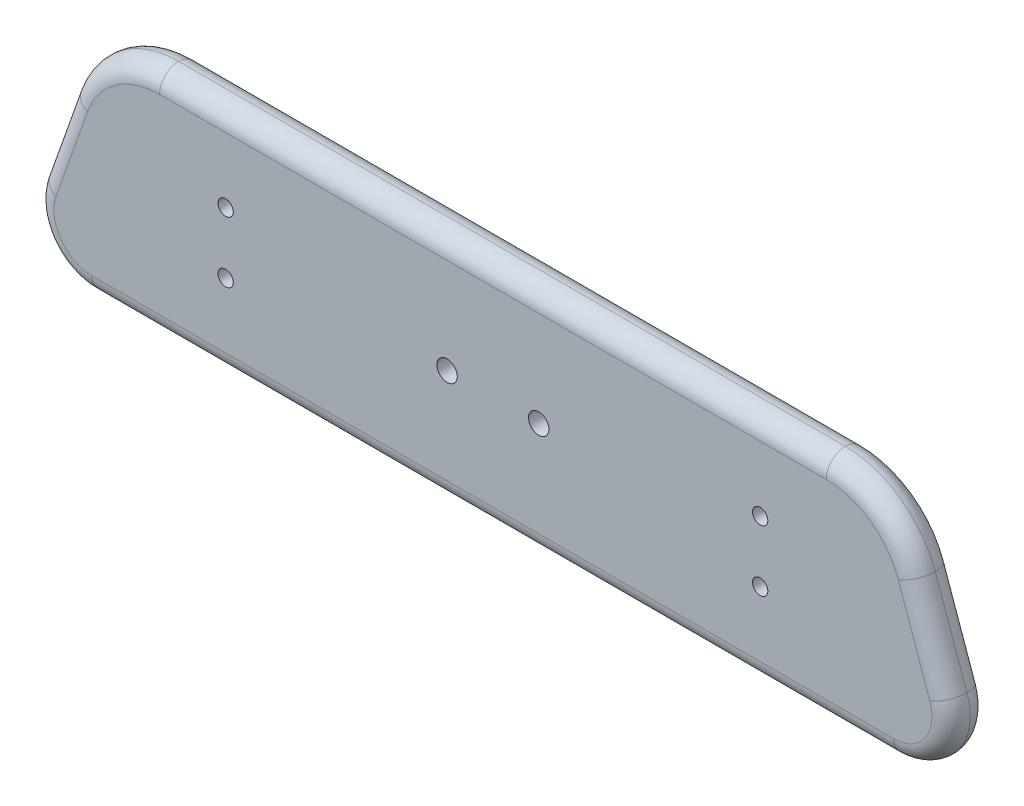
ISO-10303-21;
HEADER;
FILE_DESCRIPTION(('STEP AP214'),'2;1');
FILE_NAME('part.step','',(''),(''),'','','');
FILE_SCHEMA(('AUTOMOTIVE_DESIGN { 1 0 10303 214 1 1 1 1 }'));
ENDSEC;
DATA;
#1=APPLICATION_CONTEXT('core data for automotive mechanical design processes');
#2=APPLICATION_PROTOCOL_DEFINITION('international standard','automotive_design',2000,#1);
#3=PRODUCT_CONTEXT('',#1,'mechanical');
#4=PRODUCT('Part','Part','',(#3));
#5=PRODUCT_RELATED_PRODUCT_CATEGORY('part','',(#4));
#6=PRODUCT_DEFINITION_FORMATION('','',#4);
#7=PRODUCT_DEFINITION_CONTEXT('part definition',#1,'design');
#8=PRODUCT_DEFINITION('design','',#6,#7);
#9=PRODUCT_DEFINITION_SHAPE('','',#8);
#10=(LENGTH_UNIT() NAMED_UNIT(*) SI_UNIT(.MILLI.,.METRE.));
#11=(NAMED_UNIT(*) PLANE_ANGLE_UNIT() SI_UNIT($,.RADIAN.));
#12=(NAMED_UNIT(*) SI_UNIT($,.STERADIAN.) SOLID_ANGLE_UNIT());
#13=UNCERTAINTY_MEASURE_WITH_UNIT(LENGTH_MEASURE(1.E-05),#10,'distance_accuracy_value','');
#14=(GEOMETRIC_REPRESENTATION_CONTEXT(3) GLOBAL_UNCERTAINTY_ASSIGNED_CONTEXT((#13)) GLOBAL_UNIT_ASSIGNED_CONTEXT((#10,
#11,#12)) REPRESENTATION_CONTEXT('',''));
#15=CARTESIAN_POINT('',(0.,0.,0.));
#16=DIRECTION('',(0.,0.,1.));
#17=DIRECTION('',(1.,0.,0.));
#18=AXIS2_PLACEMENT_3D('',#15,#16,#17);
#19=CARTESIAN_POINT('',(-105.,15.,10.));
#20=DIRECTION('',(0.,0.,-1.));
#21=DIRECTION('',(-1.,0.,0.));
#22=AXIS2_PLACEMENT_3D('',#19,#20,#21);
#23=PLANE('',#22);
#24=CARTESIAN_POINT('',(12.,30.,10.));
#25=DIRECTION('',(0.,0.,-1.));
#26=DIRECTION('',(-1.,0.,0.));
#27=AXIS2_PLACEMENT_3D('',#24,#25,#26);
#28=CIRCLE('',#27,2.67221258206621);
#29=CARTESIAN_POINT('',(9.32778741793379,30.,10.));
#30=VERTEX_POINT('',#29);
#31=EDGE_CURVE('E706',#30,#30,#28,.T.);
#32=ORIENTED_EDGE('',*,*,#31,.T.);
#33=EDGE_LOOP('',(#32));
#34=FACE_BOUND('',#33,.T.);
#35=CARTESIAN_POINT('',(-12.,30.,10.));
#36=DIRECTION('',(0.,0.,-1.));
#37=DIRECTION('',(-1.,0.,0.));
#38=AXIS2_PLACEMENT_3D('',#35,#36,#37);
#39=CIRCLE('',#38,2.67221258206621);
#40=CARTESIAN_POINT('',(-14.6722125820662,30.,10.));
#41=VERTEX_POINT('',#40);
#42=EDGE_CURVE('E711',#41,#41,#39,.T.);
#43=ORIENTED_EDGE('',*,*,#42,.T.);
#44=EDGE_LOOP('',(#43));
#45=FACE_BOUND('',#44,.T.);
#46=DIRECTION('',(-0.333806859233774,-0.942641491092177,0.));
#47=VECTOR('',#46,1.);
#48=CARTESIAN_POINT('',(-114.426414910922,18.3380685923377,10.));
#49=LINE('',#48,#47);
#50=CARTESIAN_POINT('',(-106.161971375379,41.6761371846755,10.));
#51=VERTEX_POINT('',#50);
#52=CARTESIAN_POINT('',(-114.426414910922,18.3380685923377,10.));
#53=VERTEX_POINT('',#52);
#54=EDGE_CURVE('E51',#51,#53,#49,.T.);
#55=ORIENTED_EDGE('',*,*,#54,.T.);
#56=CARTESIAN_POINT('',(-105.,15.,10.));
#57=DIRECTION('',(0.,0.,-1.));
#58=DIRECTION('',(-1.,0.,0.));
#59=AXIS2_PLACEMENT_3D('',#56,#57,#58);
#60=CIRCLE('',#59,9.99999999999999);
#61=CARTESIAN_POINT('',(-105.,4.99999999999999,10.));
#62=VERTEX_POINT('',#61);
#63=EDGE_CURVE('E11',#53,#62,#60,.F.);
#64=ORIENTED_EDGE('',*,*,#63,.T.);
#65=DIRECTION('',(1.,0.,0.));
#66=VECTOR('',#65,1.);
#67=CARTESIAN_POINT('',(-105.,4.99999999999999,10.));
#68=LINE('',#67,#66);
#69=CARTESIAN_POINT('',(105.,5.00000000000001,10.));
#70=VERTEX_POINT('',#69);
#71=EDGE_CURVE('E323',#62,#70,#68,.T.);
#72=ORIENTED_EDGE('',*,*,#71,.T.);
#73=CARTESIAN_POINT('',(105.,15.,10.));
#74=DIRECTION('',(0.,0.,-1.));
#75=DIRECTION('',(-1.,0.,0.));
#76=AXIS2_PLACEMENT_3D('',#73,#74,#75);
#77=CIRCLE('',#76,10.);
#78=CARTESIAN_POINT('',(114.426414910922,18.3380685923378,10.));
#79=VERTEX_POINT('',#78);
#80=EDGE_CURVE('E326',#70,#79,#77,.F.);
#81=ORIENTED_EDGE('',*,*,#80,.T.);
#82=DIRECTION('',(-0.333806859233775,0.942641491092177,0.));
#83=VECTOR('',#82,1.);
#84=CARTESIAN_POINT('',(91.0267408639031,84.4167096525714,10.));
#85=LINE('',#84,#83);
#86=CARTESIAN_POINT('',(106.161971375379,41.6761371846755,10.));
#87=VERTEX_POINT('',#86);
#88=EDGE_CURVE('E329',#79,#87,#85,.T.);
#89=ORIENTED_EDGE('',*,*,#88,.T.);
#90=CARTESIAN_POINT('',(87.3091415535359,35.,10.));
#91=DIRECTION('',(0.,0.,-1.));
#92=DIRECTION('',(-1.,0.,0.));
#93=AXIS2_PLACEMENT_3D('',#90,#91,#92);
#94=CIRCLE('',#93,20.);
#95=CARTESIAN_POINT('',(87.309141553536,55.,10.));
#96=VERTEX_POINT('',#95);
#97=EDGE_CURVE('E153',#87,#96,#94,.F.);
#98=ORIENTED_EDGE('',*,*,#97,.T.);
#99=DIRECTION('',(-1.,0.,0.));
#100=VECTOR('',#99,1.);
#101=CARTESIAN_POINT('',(-105.,55.,10.));
#102=LINE('',#101,#100);
#103=CARTESIAN_POINT('',(-87.309141553536,55.,10.));
#104=VERTEX_POINT('',#103);
#105=EDGE_CURVE('E146',#96,#104,#102,.T.);
#106=ORIENTED_EDGE('',*,*,#105,.T.);
#107=CARTESIAN_POINT('',(-87.309141553536,35.,10.));
#108=DIRECTION('',(0.,0.,-1.));
#109=DIRECTION('',(-1.,0.,0.));
#110=AXIS2_PLACEMENT_3D('',#107,#108,#109);
#111=CIRCLE('',#110,20.);
#112=EDGE_CURVE('E150',#104,#51,#111,.F.);
#113=ORIENTED_EDGE('',*,*,#112,.T.);
#114=EDGE_LOOP('',(#55,#64,#72,#81,#89,#98,#106,#113));
#115=FACE_BOUND('',#114,.T.);
#116=CARTESIAN_POINT('',(-70.,38.,10.));
#117=DIRECTION('',(0.,0.,1.));
#118=DIRECTION('',(1.,0.,0.));
#119=AXIS2_PLACEMENT_3D('',#116,#117,#118);
#120=CIRCLE('',#119,2.);
#121=CARTESIAN_POINT('',(-68.,38.,10.));
#122=VERTEX_POINT('',#121);
#123=EDGE_CURVE('E281',#122,#122,#120,.T.);
#124=ORIENTED_EDGE('',*,*,#123,.F.);
#125=EDGE_LOOP('',(#124));
#126=FACE_BOUND('',#125,.T.);
#127=CARTESIAN_POINT('',(70.,22.,10.));
#128=DIRECTION('',(0.,0.,1.));
#129=DIRECTION('',(-1.,0.,0.));
#130=AXIS2_PLACEMENT_3D('',#127,#128,#129);
#131=CIRCLE('',#130,2.);
#132=CARTESIAN_POINT('',(68.,22.,10.));
#133=VERTEX_POINT('',#132);
#134=EDGE_CURVE('E272',#133,#133,#131,.T.);
#135=ORIENTED_EDGE('',*,*,#134,.F.);
#136=EDGE_LOOP('',(#135));
#137=FACE_BOUND('',#136,.T.);
#138=CARTESIAN_POINT('',(70.,38.,10.));
#139=DIRECTION('',(0.,0.,1.));
#140=DIRECTION('',(-1.,0.,0.));
#141=AXIS2_PLACEMENT_3D('',#138,#139,#140);
#142=CIRCLE('',#141,2.);
#143=CARTESIAN_POINT('',(68.,38.,10.));
#144=VERTEX_POINT('',#143);
#145=EDGE_CURVE('E261',#144,#144,#142,.T.);
#146=ORIENTED_EDGE('',*,*,#145,.F.);
#147=EDGE_LOOP('',(#146));
#148=FACE_BOUND('',#147,.T.);
#149=CARTESIAN_POINT('',(-70.,22.,10.));
#150=DIRECTION('',(0.,0.,1.));
#151=DIRECTION('',(1.,0.,0.));
#152=AXIS2_PLACEMENT_3D('',#149,#150,#151);
#153=CIRCLE('',#152,2.);
#154=CARTESIAN_POINT('',(-68.,22.,10.));
#155=VERTEX_POINT('',#154);
#156=EDGE_CURVE('E280',#155,#155,#153,.T.);
#157=ORIENTED_EDGE('',*,*,#156,.F.);
#158=EDGE_LOOP('',(#157));
#159=FACE_BOUND('',#158,.T.);
#160=ADVANCED_FACE('F41',(#34,#45,#115,#126,#137,#148,#159),#23,.F.);
#161=CARTESIAN_POINT('',(-105.,15.,0.));
#162=DIRECTION('',(0.,0.,-1.));
#163=DIRECTION('',(-1.,0.,0.));
#164=AXIS2_PLACEMENT_3D('',#161,#162,#163);
#165=PLANE('',#164);
#166=DIRECTION('',(0.,1.,0.));
#167=VECTOR('',#166,1.);
#168=CARTESIAN_POINT('',(-23.,50.,0.));
#169=LINE('',#168,#167);
#170=CARTESIAN_POINT('',(-23.,10.,0.));
#171=VERTEX_POINT('',#170);
#172=CARTESIAN_POINT('',(-23.,50.,0.));
#173=VERTEX_POINT('',#172);
#174=EDGE_CURVE('E59',#171,#173,#169,.T.);
#175=ORIENTED_EDGE('',*,*,#174,.F.);
#176=DIRECTION('',(-1.,0.,0.));
#177=VECTOR('',#176,1.);
#178=CARTESIAN_POINT('',(-23.,10.,0.));
#179=LINE('',#178,#177);
#180=CARTESIAN_POINT('',(23.,9.99999999999999,0.));
#181=VERTEX_POINT('',#180);
#182=EDGE_CURVE('E729',#181,#171,#179,.T.);
#183=ORIENTED_EDGE('',*,*,#182,.F.);
#184=DIRECTION('',(0.,-1.,0.));
#185=VECTOR('',#184,1.);
#186=CARTESIAN_POINT('',(23.,9.99999999999999,0.));
#187=LINE('',#186,#185);
#188=CARTESIAN_POINT('',(23.,50.,0.));
#189=VERTEX_POINT('',#188);
#190=EDGE_CURVE('E748',#189,#181,#187,.T.);
#191=ORIENTED_EDGE('',*,*,#190,.F.);
#192=DIRECTION('',(1.,0.,0.));
#193=VECTOR('',#192,1.);
#194=CARTESIAN_POINT('',(23.,50.,0.));
#195=LINE('',#194,#193);
#196=EDGE_CURVE('E744',#173,#189,#195,.T.);
#197=ORIENTED_EDGE('',*,*,#196,.F.);
#198=EDGE_LOOP('',(#175,#183,#191,#197));
#199=FACE_BOUND('',#198,.T.);
#200=DIRECTION('',(1.,0.,0.));
#201=VECTOR('',#200,1.);
#202=CARTESIAN_POINT('',(-105.,4.99999999999999,0.));
#203=LINE('',#202,#201);
#204=CARTESIAN_POINT('',(105.,5.00000000000001,0.));
#205=VERTEX_POINT('',#204);
#206=CARTESIAN_POINT('',(-105.,4.99999999999999,0.));
#207=VERTEX_POINT('',#206);
#208=EDGE_CURVE('E296',#205,#207,#203,.F.);
#209=ORIENTED_EDGE('',*,*,#208,.T.);
#210=CARTESIAN_POINT('',(-105.,15.,0.));
#211=DIRECTION('',(0.,0.,-1.));
#212=DIRECTION('',(-1.,0.,0.));
#213=AXIS2_PLACEMENT_3D('',#210,#211,#212);
#214=CIRCLE('',#213,9.99999999999999);
#215=CARTESIAN_POINT('',(-114.426414910922,18.3380685923377,0.));
#216=VERTEX_POINT('',#215);
#217=EDGE_CURVE('E319',#207,#216,#214,.T.);
#218=ORIENTED_EDGE('',*,*,#217,.T.);
#219=DIRECTION('',(-0.333806859233774,-0.942641491092177,0.));
#220=VECTOR('',#219,1.);
#221=CARTESIAN_POINT('',(-106.161971375379,41.6761371846755,0.));
#222=LINE('',#221,#220);
#223=CARTESIAN_POINT('',(-106.161971375379,41.6761371846755,0.));
#224=VERTEX_POINT('',#223);
#225=EDGE_CURVE('E316',#216,#224,#222,.F.);
#226=ORIENTED_EDGE('',*,*,#225,.T.);
#227=CARTESIAN_POINT('',(-87.309141553536,35.,0.));
#228=DIRECTION('',(0.,0.,-1.));
#229=DIRECTION('',(-1.,0.,0.));
#230=AXIS2_PLACEMENT_3D('',#227,#228,#229);
#231=CIRCLE('',#230,20.);
#232=CARTESIAN_POINT('',(-87.309141553536,55.,0.));
#233=VERTEX_POINT('',#232);
#234=EDGE_CURVE('E313',#224,#233,#231,.T.);
#235=ORIENTED_EDGE('',*,*,#234,.T.);
#236=DIRECTION('',(-1.,0.,0.));
#237=VECTOR('',#236,1.);
#238=CARTESIAN_POINT('',(87.309141553536,55.,0.));
#239=LINE('',#238,#237);
#240=CARTESIAN_POINT('',(87.309141553536,55.,0.));
#241=VERTEX_POINT('',#240);
#242=EDGE_CURVE('E310',#233,#241,#239,.F.);
#243=ORIENTED_EDGE('',*,*,#242,.T.);
#244=CARTESIAN_POINT('',(87.3091415535359,35.,0.));
#245=DIRECTION('',(0.,0.,-1.));
#246=DIRECTION('',(-1.,0.,0.));
#247=AXIS2_PLACEMENT_3D('',#244,#245,#246);
#248=CIRCLE('',#247,20.);
#249=CARTESIAN_POINT('',(106.161971375379,41.6761371846755,0.));
#250=VERTEX_POINT('',#249);
#251=EDGE_CURVE('E307',#241,#250,#248,.T.);
#252=ORIENTED_EDGE('',*,*,#251,.T.);
#253=DIRECTION('',(-0.333806859233775,0.942641491092177,0.));
#254=VECTOR('',#253,1.);
#255=CARTESIAN_POINT('',(114.426414910922,18.3380685923377,0.));
#256=LINE('',#255,#254);
#257=CARTESIAN_POINT('',(114.426414910922,18.3380685923378,0.));
#258=VERTEX_POINT('',#257);
#259=EDGE_CURVE('E304',#250,#258,#256,.F.);
#260=ORIENTED_EDGE('',*,*,#259,.T.);
#261=CARTESIAN_POINT('',(105.,15.,0.));
#262=DIRECTION('',(0.,0.,-1.));
#263=DIRECTION('',(-1.,0.,0.));
#264=AXIS2_PLACEMENT_3D('',#261,#262,#263);
#265=CIRCLE('',#264,10.);
#266=EDGE_CURVE('E107',#258,#205,#265,.T.);
#267=ORIENTED_EDGE('',*,*,#266,.T.);
#268=EDGE_LOOP('',(#209,#218,#226,#235,#243,#252,#260,#267));
#269=FACE_BOUND('',#268,.T.);
#270=ADVANCED_FACE('F399',(#199,#269),#165,.T.);
#271=CARTESIAN_POINT('',(-70.,22.,2.));
#272=DIRECTION('',(0.,0.,1.));
#273=DIRECTION('',(1.,0.,0.));
#274=AXIS2_PLACEMENT_3D('',#271,#272,#273);
#275=CYLINDRICAL_SURFACE('',#274,2.);
#276=CARTESIAN_POINT('',(-70.,22.,2.));
#277=DIRECTION('',(0.,0.,1.));
#278=DIRECTION('',(1.,0.,0.));
#279=AXIS2_PLACEMENT_3D('',#276,#277,#278);
#280=CIRCLE('',#279,2.);
#281=CARTESIAN_POINT('',(-68.,22.,2.));
#282=VERTEX_POINT('',#281);
#283=EDGE_CURVE('E292',#282,#282,#280,.T.);
#284=ORIENTED_EDGE('',*,*,#283,.F.);
#285=EDGE_LOOP('',(#284));
#286=FACE_BOUND('',#285,.T.);
#287=ORIENTED_EDGE('',*,*,#156,.T.);
#288=EDGE_LOOP('',(#287));
#289=FACE_BOUND('',#288,.T.);
#290=ADVANCED_FACE('F405',(#286,#289),#275,.F.);
#291=CARTESIAN_POINT('',(-70.,22.,2.));
#292=DIRECTION('',(0.,0.,1.));
#293=DIRECTION('',(1.,0.,0.));
#294=AXIS2_PLACEMENT_3D('',#291,#292,#293);
#295=PLANE('',#294);
#296=ORIENTED_EDGE('',*,*,#283,.T.);
#297=EDGE_LOOP('',(#296));
#298=FACE_BOUND('',#297,.T.);
#299=ADVANCED_FACE('F654',(#298),#295,.T.);
#300=CARTESIAN_POINT('',(70.,38.,2.));
#301=DIRECTION('',(0.,0.,1.));
#302=DIRECTION('',(1.,0.,0.));
#303=AXIS2_PLACEMENT_3D('',#300,#301,#302);
#304=CYLINDRICAL_SURFACE('',#303,2.);
#305=CARTESIAN_POINT('',(70.,38.,2.));
#306=DIRECTION('',(0.,0.,1.));
#307=DIRECTION('',(-1.,0.,0.));
#308=AXIS2_PLACEMENT_3D('',#305,#306,#307);
#309=CIRCLE('',#308,2.);
#310=CARTESIAN_POINT('',(68.,38.,2.));
#311=VERTEX_POINT('',#310);
#312=EDGE_CURVE('E265',#311,#311,#309,.T.);
#313=ORIENTED_EDGE('',*,*,#312,.F.);
#314=EDGE_LOOP('',(#313));
#315=FACE_BOUND('',#314,.T.);
#316=ORIENTED_EDGE('',*,*,#145,.T.);
#317=EDGE_LOOP('',(#316));
#318=FACE_BOUND('',#317,.T.);
#319=ADVANCED_FACE('F645',(#315,#318),#304,.F.);
#320=CARTESIAN_POINT('',(70.,38.,2.));
#321=DIRECTION('',(0.,0.,-1.));
#322=DIRECTION('',(-1.,0.,0.));
#323=AXIS2_PLACEMENT_3D('',#320,#321,#322);
#324=PLANE('',#323);
#325=ORIENTED_EDGE('',*,*,#312,.T.);
#326=EDGE_LOOP('',(#325));
#327=FACE_BOUND('',#326,.T.);
#328=ADVANCED_FACE('F636',(#327),#324,.F.);
#329=CARTESIAN_POINT('',(70.,22.,2.));
#330=DIRECTION('',(0.,0.,1.));
#331=DIRECTION('',(1.,0.,0.));
#332=AXIS2_PLACEMENT_3D('',#329,#330,#331);
#333=CYLINDRICAL_SURFACE('',#332,2.);
#334=CARTESIAN_POINT('',(70.,22.,2.));
#335=DIRECTION('',(0.,0.,1.));
#336=DIRECTION('',(-1.,0.,0.));
#337=AXIS2_PLACEMENT_3D('',#334,#335,#336);
#338=CIRCLE('',#337,2.);
#339=CARTESIAN_POINT('',(68.,22.,2.));
#340=VERTEX_POINT('',#339);
#341=EDGE_CURVE('E285',#340,#340,#338,.T.);
#342=ORIENTED_EDGE('',*,*,#341,.F.);
#343=EDGE_LOOP('',(#342));
#344=FACE_BOUND('',#343,.T.);
#345=ORIENTED_EDGE('',*,*,#134,.T.);
#346=EDGE_LOOP('',(#345));
#347=FACE_BOUND('',#346,.T.);
#348=ADVANCED_FACE('F627',(#344,#347),#333,.F.);
#349=CARTESIAN_POINT('',(70.,22.,2.));
#350=DIRECTION('',(0.,0.,-1.));
#351=DIRECTION('',(-1.,0.,0.));
#352=AXIS2_PLACEMENT_3D('',#349,#350,#351);
#353=PLANE('',#352);
#354=ORIENTED_EDGE('',*,*,#341,.T.);
#355=EDGE_LOOP('',(#354));
#356=FACE_BOUND('',#355,.T.);
#357=ADVANCED_FACE('F618',(#356),#353,.F.);
#358=CARTESIAN_POINT('',(-70.,38.,2.));
#359=DIRECTION('',(0.,0.,1.));
#360=DIRECTION('',(1.,0.,0.));
#361=AXIS2_PLACEMENT_3D('',#358,#359,#360);
#362=CYLINDRICAL_SURFACE('',#361,2.);
#363=CARTESIAN_POINT('',(-70.,38.,2.));
#364=DIRECTION('',(0.,0.,1.));
#365=DIRECTION('',(1.,0.,0.));
#366=AXIS2_PLACEMENT_3D('',#363,#364,#365);
#367=CIRCLE('',#366,2.);
#368=CARTESIAN_POINT('',(-68.,38.,2.));
#369=VERTEX_POINT('',#368);
#370=EDGE_CURVE('E276',#369,#369,#367,.T.);
#371=ORIENTED_EDGE('',*,*,#370,.F.);
#372=EDGE_LOOP('',(#371));
#373=FACE_BOUND('',#372,.T.);
#374=ORIENTED_EDGE('',*,*,#123,.T.);
#375=EDGE_LOOP('',(#374));
#376=FACE_BOUND('',#375,.T.);
#377=ADVANCED_FACE('F609',(#373,#376),#362,.F.);
#378=CARTESIAN_POINT('',(-70.,38.,2.));
#379=DIRECTION('',(0.,0.,1.));
#380=DIRECTION('',(1.,0.,0.));
#381=AXIS2_PLACEMENT_3D('',#378,#379,#380);
#382=PLANE('',#381);
#383=ORIENTED_EDGE('',*,*,#370,.T.);
#384=EDGE_LOOP('',(#383));
#385=FACE_BOUND('',#384,.T.);
#386=ADVANCED_FACE('F602',(#385),#382,.T.);
#387=CARTESIAN_POINT('',(87.3091415535359,35.,5.));
#388=DIRECTION('',(0.,0.,-1.));
#389=DIRECTION('',(-1.,0.,0.));
#390=AXIS2_PLACEMENT_3D('',#387,#388,#389);
#391=TOROIDAL_SURFACE('',#390,20.,5.);
#392=CARTESIAN_POINT('',(87.309141553536,55.,5.));
#393=DIRECTION('',(-1.,0.,0.));
#394=DIRECTION('',(0.,0.,1.));
#395=AXIS2_PLACEMENT_3D('',#392,#393,#394);
#396=CIRCLE('',#395,5.);
#397=CARTESIAN_POINT('',(87.309141553536,60.,5.));
#398=VERTEX_POINT('',#397);
#399=EDGE_CURVE('E45',#96,#398,#396,.T.);
#400=ORIENTED_EDGE('',*,*,#399,.F.);
#401=ORIENTED_EDGE('',*,*,#97,.F.);
#402=CARTESIAN_POINT('',(106.161971375379,41.6761371846755,5.));
#403=DIRECTION('',(0.333806859233775,-0.942641491092177,0.));
#404=DIRECTION('',(0.942641491092177,0.333806859233775,0.));
#405=AXIS2_PLACEMENT_3D('',#402,#403,#404);
#406=CIRCLE('',#405,5.);
#407=CARTESIAN_POINT('',(110.87517883084,43.3451714808444,5.));
#408=VERTEX_POINT('',#407);
#409=EDGE_CURVE('E253',#408,#87,#406,.T.);
#410=ORIENTED_EDGE('',*,*,#409,.F.);
#411=CARTESIAN_POINT('',(87.3091415535359,35.,5.));
#412=DIRECTION('',(0.,0.,-1.));
#413=DIRECTION('',(-1.,0.,0.));
#414=AXIS2_PLACEMENT_3D('',#411,#412,#413);
#415=CIRCLE('',#414,25.);
#416=EDGE_CURVE('E250',#398,#408,#415,.T.);
#417=ORIENTED_EDGE('',*,*,#416,.F.);
#418=EDGE_LOOP('',(#400,#401,#410,#417));
#419=FACE_BOUND('',#418,.T.);
#420=ADVANCED_FACE('F43',(#419),#391,.T.);
#421=CARTESIAN_POINT('',(-105.,55.,5.));
#422=DIRECTION('',(-1.,0.,0.));
#423=DIRECTION('',(0.,-1.,0.));
#424=AXIS2_PLACEMENT_3D('',#421,#422,#423);
#425=CYLINDRICAL_SURFACE('',#424,5.);
#426=ORIENTED_EDGE('',*,*,#105,.F.);
#427=ORIENTED_EDGE('',*,*,#399,.T.);
#428=DIRECTION('',(-1.,0.,0.));
#429=VECTOR('',#428,1.);
#430=CARTESIAN_POINT('',(-87.309141553536,60.,5.));
#431=LINE('',#430,#429);
#432=CARTESIAN_POINT('',(-87.309141553536,60.,5.));
#433=VERTEX_POINT('',#432);
#434=EDGE_CURVE('E160',#433,#398,#431,.F.);
#435=ORIENTED_EDGE('',*,*,#434,.F.);
#436=CARTESIAN_POINT('',(-87.309141553536,55.,5.));
#437=DIRECTION('',(-1.,0.,0.));
#438=DIRECTION('',(0.,0.,1.));
#439=AXIS2_PLACEMENT_3D('',#436,#437,#438);
#440=CIRCLE('',#439,5.);
#441=EDGE_CURVE('E157',#104,#433,#440,.T.);
#442=ORIENTED_EDGE('',*,*,#441,.F.);
#443=EDGE_LOOP('',(#426,#427,#435,#442));
#444=FACE_BOUND('',#443,.T.);
#445=ADVANCED_FACE('F158',(#444),#425,.T.);
#446=CARTESIAN_POINT('',(91.0267408639031,84.4167096525714,5.));
#447=DIRECTION('',(-0.333806859233775,0.942641491092177,0.));
#448=DIRECTION('',(-0.942641491092177,-0.333806859233775,0.));
#449=AXIS2_PLACEMENT_3D('',#446,#447,#448);
#450=CYLINDRICAL_SURFACE('',#449,5.);
#451=ORIENTED_EDGE('',*,*,#409,.T.);
#452=ORIENTED_EDGE('',*,*,#88,.F.);
#453=CARTESIAN_POINT('',(114.426414910922,18.3380685923378,5.));
#454=DIRECTION('',(0.333806859233775,-0.942641491092177,0.));
#455=DIRECTION('',(0.942641491092177,0.333806859233775,0.));
#456=AXIS2_PLACEMENT_3D('',#453,#454,#455);
#457=CIRCLE('',#456,5.);
#458=CARTESIAN_POINT('',(119.139622366383,20.0071028885066,5.));
#459=VERTEX_POINT('',#458);
#460=EDGE_CURVE('E164',#459,#79,#457,.T.);
#461=ORIENTED_EDGE('',*,*,#460,.F.);
#462=DIRECTION('',(-0.333806859233775,0.942641491092177,0.));
#463=VECTOR('',#462,1.);
#464=CARTESIAN_POINT('',(110.87517883084,43.3451714808444,5.));
#465=LINE('',#464,#463);
#466=EDGE_CURVE('E237',#408,#459,#465,.F.);
#467=ORIENTED_EDGE('',*,*,#466,.F.);
#468=EDGE_LOOP('',(#451,#452,#461,#467));
#469=FACE_BOUND('',#468,.T.);
#470=ADVANCED_FACE('F390',(#469),#450,.T.);
#471=CARTESIAN_POINT('',(87.3091415535359,35.,5.));
#472=DIRECTION('',(0.,0.,-1.));
#473=DIRECTION('',(-1.,0.,0.));
#474=AXIS2_PLACEMENT_3D('',#471,#472,#473);
#475=TOROIDAL_SURFACE('',#474,20.,5.);
#476=CARTESIAN_POINT('',(106.161971375379,41.6761371846755,5.));
#477=DIRECTION('',(0.333806859233775,-0.942641491092177,0.));
#478=DIRECTION('',(0.942641491092177,0.333806859233775,0.));
#479=AXIS2_PLACEMENT_3D('',#476,#477,#478);
#480=CIRCLE('',#479,5.);
#481=EDGE_CURVE('E233',#250,#408,#480,.T.);
#482=ORIENTED_EDGE('',*,*,#481,.F.);
#483=ORIENTED_EDGE('',*,*,#251,.F.);
#484=CARTESIAN_POINT('',(87.309141553536,55.,5.));
#485=DIRECTION('',(-1.,0.,0.));
#486=DIRECTION('',(0.,0.,1.));
#487=AXIS2_PLACEMENT_3D('',#484,#485,#486);
#488=CIRCLE('',#487,5.);
#489=EDGE_CURVE('E246',#398,#241,#488,.T.);
#490=ORIENTED_EDGE('',*,*,#489,.F.);
#491=ORIENTED_EDGE('',*,*,#416,.T.);
#492=EDGE_LOOP('',(#482,#483,#490,#491));
#493=FACE_BOUND('',#492,.T.);
#494=ADVANCED_FACE('F358',(#493),#475,.T.);
#495=CARTESIAN_POINT('',(-87.309141553536,55.,5.));
#496=DIRECTION('',(1.,0.,0.));
#497=DIRECTION('',(0.,1.,0.));
#498=AXIS2_PLACEMENT_3D('',#495,#496,#497);
#499=CYLINDRICAL_SURFACE('',#498,5.);
#500=ORIENTED_EDGE('',*,*,#489,.T.);
#501=ORIENTED_EDGE('',*,*,#242,.F.);
#502=CARTESIAN_POINT('',(-87.309141553536,55.,5.));
#503=DIRECTION('',(-1.,0.,0.));
#504=DIRECTION('',(0.,0.,1.));
#505=AXIS2_PLACEMENT_3D('',#502,#503,#504);
#506=CIRCLE('',#505,5.);
#507=EDGE_CURVE('E229',#433,#233,#506,.T.);
#508=ORIENTED_EDGE('',*,*,#507,.F.);
#509=ORIENTED_EDGE('',*,*,#434,.T.);
#510=EDGE_LOOP('',(#500,#501,#508,#509));
#511=FACE_BOUND('',#510,.T.);
#512=ADVANCED_FACE('F361',(#511),#499,.T.);
#513=CARTESIAN_POINT('',(-87.309141553536,35.,5.));
#514=DIRECTION('',(0.,0.,-1.));
#515=DIRECTION('',(-1.,0.,0.));
#516=AXIS2_PLACEMENT_3D('',#513,#514,#515);
#517=TOROIDAL_SURFACE('',#516,20.,5.);
#518=ORIENTED_EDGE('',*,*,#112,.F.);
#519=ORIENTED_EDGE('',*,*,#441,.T.);
#520=CARTESIAN_POINT('',(-87.309141553536,35.,5.));
#521=DIRECTION('',(0.,0.,-1.));
#522=DIRECTION('',(-1.,0.,0.));
#523=AXIS2_PLACEMENT_3D('',#520,#521,#522);
#524=CIRCLE('',#523,25.);
#525=CARTESIAN_POINT('',(-110.87517883084,43.3451714808443,5.));
#526=VERTEX_POINT('',#525);
#527=EDGE_CURVE('E225',#526,#433,#524,.T.);
#528=ORIENTED_EDGE('',*,*,#527,.F.);
#529=CARTESIAN_POINT('',(-106.161971375379,41.6761371846755,5.));
#530=DIRECTION('',(-0.333806859233775,-0.942641491092177,0.));
#531=DIRECTION('',(0.942641491092177,-0.333806859233775,0.));
#532=AXIS2_PLACEMENT_3D('',#529,#530,#531);
#533=CIRCLE('',#532,5.);
#534=EDGE_CURVE('E168',#51,#526,#533,.T.);
#535=ORIENTED_EDGE('',*,*,#534,.F.);
#536=EDGE_LOOP('',(#518,#519,#528,#535));
#537=FACE_BOUND('',#536,.T.);
#538=ADVANCED_FACE('F166',(#537),#517,.T.);
#539=CARTESIAN_POINT('',(105.,15.,5.));
#540=DIRECTION('',(0.,0.,-1.));
#541=DIRECTION('',(-1.,0.,0.));
#542=AXIS2_PLACEMENT_3D('',#539,#540,#541);
#543=TOROIDAL_SURFACE('',#542,10.,5.);
#544=ORIENTED_EDGE('',*,*,#460,.T.);
#545=ORIENTED_EDGE('',*,*,#80,.F.);
#546=CARTESIAN_POINT('',(105.,5.,5.));
#547=DIRECTION('',(-1.,0.,0.));
#548=DIRECTION('',(0.,0.,1.));
#549=AXIS2_PLACEMENT_3D('',#546,#547,#548);
#550=CIRCLE('',#549,5.);
#551=CARTESIAN_POINT('',(105.,0.,5.));
#552=VERTEX_POINT('',#551);
#553=EDGE_CURVE('E219',#552,#70,#550,.T.);
#554=ORIENTED_EDGE('',*,*,#553,.F.);
#555=CARTESIAN_POINT('',(105.,15.,5.));
#556=DIRECTION('',(0.,0.,-1.));
#557=DIRECTION('',(-1.,0.,0.));
#558=AXIS2_PLACEMENT_3D('',#555,#556,#557);
#559=CIRCLE('',#558,15.);
#560=EDGE_CURVE('E215',#459,#552,#559,.T.);
#561=ORIENTED_EDGE('',*,*,#560,.F.);
#562=EDGE_LOOP('',(#544,#545,#554,#561));
#563=FACE_BOUND('',#562,.T.);
#564=ADVANCED_FACE('F376',(#563),#543,.T.);
#565=CARTESIAN_POINT('',(106.161971375379,41.6761371846755,5.));
#566=DIRECTION('',(0.333806859233775,-0.942641491092177,0.));
#567=DIRECTION('',(0.942641491092177,0.333806859233775,0.));
#568=AXIS2_PLACEMENT_3D('',#565,#566,#567);
#569=CYLINDRICAL_SURFACE('',#568,5.);
#570=ORIENTED_EDGE('',*,*,#481,.T.);
#571=ORIENTED_EDGE('',*,*,#466,.T.);
#572=CARTESIAN_POINT('',(114.426414910922,18.3380685923378,5.));
#573=DIRECTION('',(0.333806859233775,-0.942641491092177,0.));
#574=DIRECTION('',(0.942641491092177,0.333806859233775,0.));
#575=AXIS2_PLACEMENT_3D('',#572,#573,#574);
#576=CIRCLE('',#575,5.);
#577=EDGE_CURVE('E211',#258,#459,#576,.T.);
#578=ORIENTED_EDGE('',*,*,#577,.F.);
#579=ORIENTED_EDGE('',*,*,#259,.F.);
#580=EDGE_LOOP('',(#570,#571,#578,#579));
#581=FACE_BOUND('',#580,.T.);
#582=ADVANCED_FACE('F389',(#581),#569,.T.);
#583=CARTESIAN_POINT('',(-87.309141553536,35.,5.));
#584=DIRECTION('',(0.,0.,-1.));
#585=DIRECTION('',(-1.,0.,0.));
#586=AXIS2_PLACEMENT_3D('',#583,#584,#585);
#587=TOROIDAL_SURFACE('',#586,20.,5.);
#588=ORIENTED_EDGE('',*,*,#507,.T.);
#589=ORIENTED_EDGE('',*,*,#234,.F.);
#590=CARTESIAN_POINT('',(-106.161971375379,41.6761371846755,5.));
#591=DIRECTION('',(-0.333806859233775,-0.942641491092177,0.));
#592=DIRECTION('',(0.942641491092177,-0.333806859233775,0.));
#593=AXIS2_PLACEMENT_3D('',#590,#591,#592);
#594=CIRCLE('',#593,5.);
#595=EDGE_CURVE('E207',#526,#224,#594,.T.);
#596=ORIENTED_EDGE('',*,*,#595,.F.);
#597=ORIENTED_EDGE('',*,*,#527,.T.);
#598=EDGE_LOOP('',(#588,#589,#596,#597));
#599=FACE_BOUND('',#598,.T.);
#600=ADVANCED_FACE('F365',(#599),#587,.T.);
#601=CARTESIAN_POINT('',(-114.426414910922,18.3380685923377,5.));
#602=DIRECTION('',(-0.333806859233774,-0.942641491092177,0.));
#603=DIRECTION('',(0.942641491092177,-0.333806859233774,0.));
#604=AXIS2_PLACEMENT_3D('',#601,#602,#603);
#605=CYLINDRICAL_SURFACE('',#604,5.);
#606=ORIENTED_EDGE('',*,*,#54,.F.);
#607=ORIENTED_EDGE('',*,*,#534,.T.);
#608=DIRECTION('',(-0.333806859233774,-0.942641491092177,0.));
#609=VECTOR('',#608,1.);
#610=CARTESIAN_POINT('',(-119.139622366383,20.0071028885066,5.));
#611=LINE('',#610,#609);
#612=CARTESIAN_POINT('',(-119.139622366383,20.0071028885066,5.));
#613=VERTEX_POINT('',#612);
#614=EDGE_CURVE('E203',#613,#526,#611,.F.);
#615=ORIENTED_EDGE('',*,*,#614,.F.);
#616=CARTESIAN_POINT('',(-114.426414910922,18.3380685923377,5.));
#617=DIRECTION('',(-0.333806859233775,-0.942641491092177,0.));
#618=DIRECTION('',(0.942641491092177,-0.333806859233775,0.));
#619=AXIS2_PLACEMENT_3D('',#616,#617,#618);
#620=CIRCLE('',#619,5.);
#621=EDGE_CURVE('E199',#53,#613,#620,.T.);
#622=ORIENTED_EDGE('',*,*,#621,.F.);
#623=EDGE_LOOP('',(#606,#607,#615,#622));
#624=FACE_BOUND('',#623,.T.);
#625=ADVANCED_FACE('F367',(#624),#605,.T.);
#626=CARTESIAN_POINT('',(-105.,4.99999999999999,5.));
#627=DIRECTION('',(1.,0.,0.));
#628=DIRECTION('',(0.,1.,0.));
#629=AXIS2_PLACEMENT_3D('',#626,#627,#628);
#630=CYLINDRICAL_SURFACE('',#629,5.);
#631=ORIENTED_EDGE('',*,*,#553,.T.);
#632=ORIENTED_EDGE('',*,*,#71,.F.);
#633=CARTESIAN_POINT('',(-105.,4.99999999999999,5.));
#634=DIRECTION('',(-1.,0.,0.));
#635=DIRECTION('',(0.,0.,1.));
#636=AXIS2_PLACEMENT_3D('',#633,#634,#635);
#637=CIRCLE('',#636,5.);
#638=CARTESIAN_POINT('',(-105.,0.,5.));
#639=VERTEX_POINT('',#638);
#640=EDGE_CURVE('E196',#639,#62,#637,.T.);
#641=ORIENTED_EDGE('',*,*,#640,.F.);
#642=DIRECTION('',(1.,0.,0.));
#643=VECTOR('',#642,1.);
#644=CARTESIAN_POINT('',(0.,0.,5.));
#645=LINE('',#644,#643);
#646=EDGE_CURVE('E192',#552,#639,#645,.F.);
#647=ORIENTED_EDGE('',*,*,#646,.F.);
#648=EDGE_LOOP('',(#631,#632,#641,#647));
#649=FACE_BOUND('',#648,.T.);
#650=ADVANCED_FACE('F379',(#649),#630,.T.);
#651=CARTESIAN_POINT('',(105.,15.,5.));
#652=DIRECTION('',(0.,0.,-1.));
#653=DIRECTION('',(-1.,0.,0.));
#654=AXIS2_PLACEMENT_3D('',#651,#652,#653);
#655=TOROIDAL_SURFACE('',#654,10.,5.);
#656=ORIENTED_EDGE('',*,*,#577,.T.);
#657=ORIENTED_EDGE('',*,*,#560,.T.);
#658=CARTESIAN_POINT('',(105.,5.,5.));
#659=DIRECTION('',(-1.,0.,0.));
#660=DIRECTION('',(0.,0.,1.));
#661=AXIS2_PLACEMENT_3D('',#658,#659,#660);
#662=CIRCLE('',#661,5.);
#663=EDGE_CURVE('E188',#205,#552,#662,.T.);
#664=ORIENTED_EDGE('',*,*,#663,.F.);
#665=ORIENTED_EDGE('',*,*,#266,.F.);
#666=EDGE_LOOP('',(#656,#657,#664,#665));
#667=FACE_BOUND('',#666,.T.);
#668=ADVANCED_FACE('F385',(#667),#655,.T.);
#669=CARTESIAN_POINT('',(-114.426414910922,18.3380685923377,5.));
#670=DIRECTION('',(0.333806859233774,0.942641491092177,0.));
#671=DIRECTION('',(-0.942641491092177,0.333806859233774,0.));
#672=AXIS2_PLACEMENT_3D('',#669,#670,#671);
#673=CYLINDRICAL_SURFACE('',#672,5.);
#674=ORIENTED_EDGE('',*,*,#595,.T.);
#675=ORIENTED_EDGE('',*,*,#225,.F.);
#676=CARTESIAN_POINT('',(-114.426414910922,18.3380685923377,5.));
#677=DIRECTION('',(-0.333806859233774,-0.942641491092177,0.));
#678=DIRECTION('',(0.942641491092177,-0.333806859233774,0.));
#679=AXIS2_PLACEMENT_3D('',#676,#677,#678);
#680=CIRCLE('',#679,5.);
#681=EDGE_CURVE('E185',#613,#216,#680,.T.);
#682=ORIENTED_EDGE('',*,*,#681,.F.);
#683=ORIENTED_EDGE('',*,*,#614,.T.);
#684=EDGE_LOOP('',(#674,#675,#682,#683));
#685=FACE_BOUND('',#684,.T.);
#686=ADVANCED_FACE('F422',(#685),#673,.T.);
#687=CARTESIAN_POINT('',(-105.,15.,5.));
#688=DIRECTION('',(0.,0.,-1.));
#689=DIRECTION('',(-1.,0.,0.));
#690=AXIS2_PLACEMENT_3D('',#687,#688,#689);
#691=TOROIDAL_SURFACE('',#690,9.99999999999999,5.);
#692=ORIENTED_EDGE('',*,*,#63,.F.);
#693=ORIENTED_EDGE('',*,*,#621,.T.);
#694=CARTESIAN_POINT('',(-105.,15.,5.));
#695=DIRECTION('',(0.,0.,-1.));
#696=DIRECTION('',(-1.,0.,0.));
#697=AXIS2_PLACEMENT_3D('',#694,#695,#696);
#698=CIRCLE('',#697,15.);
#699=EDGE_CURVE('E180',#639,#613,#698,.T.);
#700=ORIENTED_EDGE('',*,*,#699,.F.);
#701=ORIENTED_EDGE('',*,*,#640,.T.);
#702=EDGE_LOOP('',(#692,#693,#700,#701));
#703=FACE_BOUND('',#702,.T.);
#704=ADVANCED_FACE('F372',(#703),#691,.T.);
#705=CARTESIAN_POINT('',(0.,5.,5.));
#706=DIRECTION('',(-1.,0.,0.));
#707=DIRECTION('',(0.,-1.,0.));
#708=AXIS2_PLACEMENT_3D('',#705,#706,#707);
#709=CYLINDRICAL_SURFACE('',#708,5.);
#710=ORIENTED_EDGE('',*,*,#663,.T.);
#711=ORIENTED_EDGE('',*,*,#646,.T.);
#712=CARTESIAN_POINT('',(-105.,4.99999999999999,5.));
#713=DIRECTION('',(-1.,0.,0.));
#714=DIRECTION('',(0.,0.,1.));
#715=AXIS2_PLACEMENT_3D('',#712,#713,#714);
#716=CIRCLE('',#715,5.);
#717=EDGE_CURVE('E176',#207,#639,#716,.T.);
#718=ORIENTED_EDGE('',*,*,#717,.F.);
#719=ORIENTED_EDGE('',*,*,#208,.F.);
#720=EDGE_LOOP('',(#710,#711,#718,#719));
#721=FACE_BOUND('',#720,.T.);
#722=ADVANCED_FACE('F383',(#721),#709,.T.);
#723=CARTESIAN_POINT('',(-105.,15.,5.));
#724=DIRECTION('',(0.,0.,-1.));
#725=DIRECTION('',(-1.,0.,0.));
#726=AXIS2_PLACEMENT_3D('',#723,#724,#725);
#727=TOROIDAL_SURFACE('',#726,9.99999999999999,5.);
#728=ORIENTED_EDGE('',*,*,#681,.T.);
#729=ORIENTED_EDGE('',*,*,#217,.F.);
#730=ORIENTED_EDGE('',*,*,#717,.T.);
#731=ORIENTED_EDGE('',*,*,#699,.T.);
#732=EDGE_LOOP('',(#728,#729,#730,#731));
#733=FACE_BOUND('',#732,.T.);
#734=ADVANCED_FACE('F413',(#733),#727,.T.);
#735=CARTESIAN_POINT('',(-23.,50.,4.));
#736=DIRECTION('',(-1.,0.,0.));
#737=DIRECTION('',(0.,-1.,0.));
#738=AXIS2_PLACEMENT_3D('',#735,#736,#737);
#739=PLANE('',#738);
#740=ORIENTED_EDGE('',*,*,#174,.T.);
#741=DIRECTION('',(0.,0.,-1.));
#742=VECTOR('',#741,1.);
#743=CARTESIAN_POINT('',(-23.,50.,4.));
#744=LINE('',#743,#742);
#745=CARTESIAN_POINT('',(-23.,50.,4.));
#746=VERTEX_POINT('',#745);
#747=EDGE_CURVE('E741',#746,#173,#744,.T.);
#748=ORIENTED_EDGE('',*,*,#747,.F.);
#749=DIRECTION('',(0.,1.,0.));
#750=VECTOR('',#749,1.);
#751=CARTESIAN_POINT('',(-23.,50.,4.));
#752=LINE('',#751,#750);
#753=CARTESIAN_POINT('',(-23.,10.,4.));
#754=VERTEX_POINT('',#753);
#755=EDGE_CURVE('E724',#754,#746,#752,.T.);
#756=ORIENTED_EDGE('',*,*,#755,.F.);
#757=DIRECTION('',(0.,0.,-1.));
#758=VECTOR('',#757,1.);
#759=CARTESIAN_POINT('',(-23.,10.,4.));
#760=LINE('',#759,#758);
#761=EDGE_CURVE('E181',#754,#171,#760,.T.);
#762=ORIENTED_EDGE('',*,*,#761,.T.);
#763=EDGE_LOOP('',(#740,#748,#756,#762));
#764=FACE_BOUND('',#763,.T.);
#765=ADVANCED_FACE('F416',(#764),#739,.F.);
#766=CARTESIAN_POINT('',(-23.,10.,4.));
#767=DIRECTION('',(0.,-1.,0.));
#768=DIRECTION('',(1.,0.,0.));
#769=AXIS2_PLACEMENT_3D('',#766,#767,#768);
#770=PLANE('',#769);
#771=ORIENTED_EDGE('',*,*,#182,.T.);
#772=ORIENTED_EDGE('',*,*,#761,.F.);
#773=DIRECTION('',(-1.,0.,0.));
#774=VECTOR('',#773,1.);
#775=CARTESIAN_POINT('',(-23.,10.,4.));
#776=LINE('',#775,#774);
#777=CARTESIAN_POINT('',(23.,9.99999999999999,4.));
#778=VERTEX_POINT('',#777);
#779=EDGE_CURVE('E737',#778,#754,#776,.T.);
#780=ORIENTED_EDGE('',*,*,#779,.F.);
#781=DIRECTION('',(0.,0.,-1.));
#782=VECTOR('',#781,1.);
#783=CARTESIAN_POINT('',(23.,9.99999999999999,4.));
#784=LINE('',#783,#782);
#785=EDGE_CURVE('E757',#778,#181,#784,.T.);
#786=ORIENTED_EDGE('',*,*,#785,.T.);
#787=EDGE_LOOP('',(#771,#772,#780,#786));
#788=FACE_BOUND('',#787,.T.);
#789=ADVANCED_FACE('F495',(#788),#770,.F.);
#790=CARTESIAN_POINT('',(23.,9.99999999999999,4.));
#791=DIRECTION('',(1.,0.,0.));
#792=DIRECTION('',(0.,1.,0.));
#793=AXIS2_PLACEMENT_3D('',#790,#791,#792);
#794=PLANE('',#793);
#795=ORIENTED_EDGE('',*,*,#190,.T.);
#796=ORIENTED_EDGE('',*,*,#785,.F.);
#797=DIRECTION('',(0.,-1.,0.));
#798=VECTOR('',#797,1.);
#799=CARTESIAN_POINT('',(23.,9.99999999999999,4.));
#800=LINE('',#799,#798);
#801=CARTESIAN_POINT('',(23.,50.,4.));
#802=VERTEX_POINT('',#801);
#803=EDGE_CURVE('E733',#802,#778,#800,.T.);
#804=ORIENTED_EDGE('',*,*,#803,.F.);
#805=DIRECTION('',(0.,0.,-1.));
#806=VECTOR('',#805,1.);
#807=CARTESIAN_POINT('',(23.,50.,4.));
#808=LINE('',#807,#806);
#809=EDGE_CURVE('E761',#802,#189,#808,.T.);
#810=ORIENTED_EDGE('',*,*,#809,.T.);
#811=EDGE_LOOP('',(#795,#796,#804,#810));
#812=FACE_BOUND('',#811,.T.);
#813=ADVANCED_FACE('F502',(#812),#794,.F.);
#814=CARTESIAN_POINT('',(23.,50.,4.));
#815=DIRECTION('',(0.,1.,0.));
#816=DIRECTION('',(-1.,0.,0.));
#817=AXIS2_PLACEMENT_3D('',#814,#815,#816);
#818=PLANE('',#817);
#819=ORIENTED_EDGE('',*,*,#196,.T.);
#820=ORIENTED_EDGE('',*,*,#809,.F.);
#821=DIRECTION('',(1.,0.,0.));
#822=VECTOR('',#821,1.);
#823=CARTESIAN_POINT('',(23.,50.,4.));
#824=LINE('',#823,#822);
#825=EDGE_CURVE('E728',#746,#802,#824,.T.);
#826=ORIENTED_EDGE('',*,*,#825,.F.);
#827=ORIENTED_EDGE('',*,*,#747,.T.);
#828=EDGE_LOOP('',(#819,#820,#826,#827));
#829=FACE_BOUND('',#828,.T.);
#830=ADVANCED_FACE('F510',(#829),#818,.F.);
#831=CARTESIAN_POINT('',(0.,0.,4.));
#832=DIRECTION('',(0.,0.,1.));
#833=DIRECTION('',(1.,0.,0.));
#834=AXIS2_PLACEMENT_3D('',#831,#832,#833);
#835=PLANE('',#834);
#836=CARTESIAN_POINT('',(12.,30.,4.));
#837=DIRECTION('',(0.,0.,-1.));
#838=DIRECTION('',(-1.,0.,0.));
#839=AXIS2_PLACEMENT_3D('',#836,#837,#838);
#840=CIRCLE('',#839,2.67221258206621);
#841=CARTESIAN_POINT('',(9.32778741793379,30.,4.));
#842=VERTEX_POINT('',#841);
#843=EDGE_CURVE('E709',#842,#842,#840,.T.);
#844=ORIENTED_EDGE('',*,*,#843,.F.);
#845=EDGE_LOOP('',(#844));
#846=FACE_BOUND('',#845,.T.);
#847=CARTESIAN_POINT('',(-12.,30.,4.));
#848=DIRECTION('',(0.,0.,-1.));
#849=DIRECTION('',(-1.,0.,0.));
#850=AXIS2_PLACEMENT_3D('',#847,#848,#849);
#851=CIRCLE('',#850,2.67221258206621);
#852=CARTESIAN_POINT('',(-14.6722125820662,30.,4.));
#853=VERTEX_POINT('',#852);
#854=EDGE_CURVE('E718',#853,#853,#851,.T.);
#855=ORIENTED_EDGE('',*,*,#854,.F.);
#856=EDGE_LOOP('',(#855));
#857=FACE_BOUND('',#856,.T.);
#858=ORIENTED_EDGE('',*,*,#755,.T.);
#859=ORIENTED_EDGE('',*,*,#825,.T.);
#860=ORIENTED_EDGE('',*,*,#803,.T.);
#861=ORIENTED_EDGE('',*,*,#779,.T.);
#862=EDGE_LOOP('',(#858,#859,#860,#861));
#863=FACE_BOUND('',#862,.T.);
#864=ADVANCED_FACE('F518',(#846,#857,#863),#835,.F.);
#865=CARTESIAN_POINT('',(-12.,30.,10.));
#866=DIRECTION('',(0.,0.,-1.));
#867=DIRECTION('',(-1.,0.,0.));
#868=AXIS2_PLACEMENT_3D('',#865,#866,#867);
#869=CYLINDRICAL_SURFACE('',#868,2.67221258206621);
#870=ORIENTED_EDGE('',*,*,#42,.F.);
#871=EDGE_LOOP('',(#870));
#872=FACE_BOUND('',#871,.T.);
#873=ORIENTED_EDGE('',*,*,#854,.T.);
#874=EDGE_LOOP('',(#873));
#875=FACE_BOUND('',#874,.T.);
#876=ADVANCED_FACE('F526',(#872,#875),#869,.F.);
#877=CARTESIAN_POINT('',(12.,30.,10.));
#878=DIRECTION('',(0.,0.,-1.));
#879=DIRECTION('',(-1.,0.,0.));
#880=AXIS2_PLACEMENT_3D('',#877,#878,#879);
#881=CYLINDRICAL_SURFACE('',#880,2.67221258206621);
#882=ORIENTED_EDGE('',*,*,#31,.F.);
#883=EDGE_LOOP('',(#882));
#884=FACE_BOUND('',#883,.T.);
#885=ORIENTED_EDGE('',*,*,#843,.T.);
#886=EDGE_LOOP('',(#885));
#887=FACE_BOUND('',#886,.T.);
#888=ADVANCED_FACE('F534',(#884,#887),#881,.F.);
#889=CLOSED_SHELL('',(#160,#270,#290,#299,#319,#328,#348,#357,#377,#386,#420,#445,#470,#494,
#512,#538,#564,#582,#600,#625,#650,#668,#686,#704,#722,#734,#765,#789,#813,#830,#864,#876,#888));
#890=MANIFOLD_SOLID_BREP('B2',#889);
#891=ADVANCED_BREP_SHAPE_REPRESENTATION('',(#18,#890),#14);
#892=SHAPE_DEFINITION_REPRESENTATION(#9,#891);
ENDSEC;
END-ISO-10303-21;
